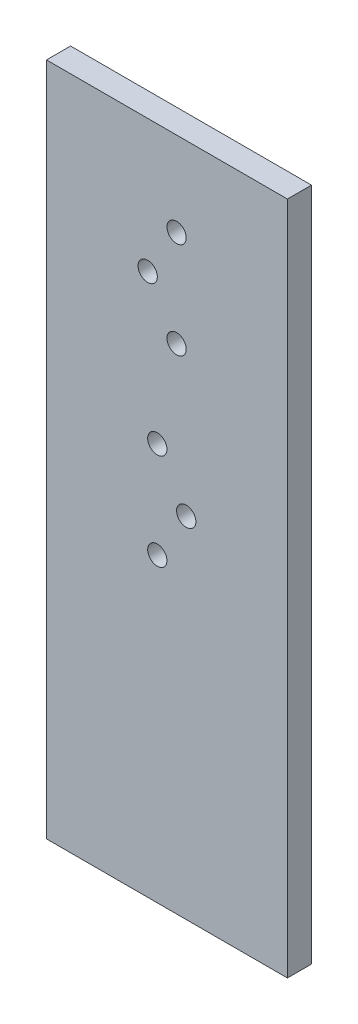
ISO-10303-21;
HEADER;
FILE_DESCRIPTION(('STEP AP214'),'2;1');
FILE_NAME('part.step','',(''),(''),'','','');
FILE_SCHEMA(('AUTOMOTIVE_DESIGN { 1 0 10303 214 1 1 1 1 }'));
ENDSEC;
DATA;
#1=APPLICATION_CONTEXT('core data for automotive mechanical design processes');
#2=APPLICATION_PROTOCOL_DEFINITION('international standard','automotive_design',2000,#1);
#3=PRODUCT_CONTEXT('',#1,'mechanical');
#4=PRODUCT('Part','Part','',(#3));
#5=PRODUCT_RELATED_PRODUCT_CATEGORY('part','',(#4));
#6=PRODUCT_DEFINITION_FORMATION('','',#4);
#7=PRODUCT_DEFINITION_CONTEXT('part definition',#1,'design');
#8=PRODUCT_DEFINITION('design','',#6,#7);
#9=PRODUCT_DEFINITION_SHAPE('','',#8);
#10=(LENGTH_UNIT() NAMED_UNIT(*) SI_UNIT(.MILLI.,.METRE.));
#11=(NAMED_UNIT(*) PLANE_ANGLE_UNIT() SI_UNIT($,.RADIAN.));
#12=(NAMED_UNIT(*) SI_UNIT($,.STERADIAN.) SOLID_ANGLE_UNIT());
#13=UNCERTAINTY_MEASURE_WITH_UNIT(LENGTH_MEASURE(1.E-05),#10,'distance_accuracy_value','');
#14=(GEOMETRIC_REPRESENTATION_CONTEXT(3) GLOBAL_UNCERTAINTY_ASSIGNED_CONTEXT((#13)) GLOBAL_UNIT_ASSIGNED_CONTEXT((#10,
#11,#12)) REPRESENTATION_CONTEXT('',''));
#15=CARTESIAN_POINT('',(0.,0.,0.));
#16=DIRECTION('',(0.,0.,1.));
#17=DIRECTION('',(1.,0.,0.));
#18=AXIS2_PLACEMENT_3D('',#15,#16,#17);
#19=CARTESIAN_POINT('',(-25.,-70.,5.));
#20=DIRECTION('',(1.,0.,0.));
#21=DIRECTION('',(0.,0.,-1.));
#22=AXIS2_PLACEMENT_3D('',#19,#20,#21);
#23=PLANE('',#22);
#24=DIRECTION('',(0.,-1.,0.));
#25=VECTOR('',#24,1.);
#26=CARTESIAN_POINT('',(-25.,-70.,0.));
#27=LINE('',#26,#25);
#28=CARTESIAN_POINT('',(-25.,70.,0.));
#29=VERTEX_POINT('',#28);
#30=CARTESIAN_POINT('',(-25.,-70.,0.));
#31=VERTEX_POINT('',#30);
#32=EDGE_CURVE('E95',#29,#31,#27,.T.);
#33=ORIENTED_EDGE('',*,*,#32,.T.);
#34=DIRECTION('',(0.,0.,-1.));
#35=VECTOR('',#34,1.);
#36=CARTESIAN_POINT('',(-25.,-70.,5.));
#37=LINE('',#36,#35);
#38=CARTESIAN_POINT('',(-25.,-70.,5.));
#39=VERTEX_POINT('',#38);
#40=EDGE_CURVE('E11',#39,#31,#37,.T.);
#41=ORIENTED_EDGE('',*,*,#40,.F.);
#42=DIRECTION('',(0.,-1.,0.));
#43=VECTOR('',#42,1.);
#44=CARTESIAN_POINT('',(-25.,-70.,5.));
#45=LINE('',#44,#43);
#46=CARTESIAN_POINT('',(-25.,70.,5.));
#47=VERTEX_POINT('',#46);
#48=EDGE_CURVE('E83',#47,#39,#45,.T.);
#49=ORIENTED_EDGE('',*,*,#48,.F.);
#50=DIRECTION('',(0.,0.,-1.));
#51=VECTOR('',#50,1.);
#52=CARTESIAN_POINT('',(-25.,70.,5.));
#53=LINE('',#52,#51);
#54=EDGE_CURVE('E91',#47,#29,#53,.T.);
#55=ORIENTED_EDGE('',*,*,#54,.T.);
#56=EDGE_LOOP('',(#33,#41,#49,#55));
#57=FACE_BOUND('',#56,.T.);
#58=ADVANCED_FACE('F32',(#57),#23,.F.);
#59=CARTESIAN_POINT('',(25.,-70.,5.));
#60=DIRECTION('',(0.,1.,0.));
#61=DIRECTION('',(0.,0.,1.));
#62=AXIS2_PLACEMENT_3D('',#59,#60,#61);
#63=PLANE('',#62);
#64=DIRECTION('',(1.,0.,0.));
#65=VECTOR('',#64,1.);
#66=CARTESIAN_POINT('',(25.,-70.,0.));
#67=LINE('',#66,#65);
#68=CARTESIAN_POINT('',(25.,-70.,0.));
#69=VERTEX_POINT('',#68);
#70=EDGE_CURVE('E87',#31,#69,#67,.T.);
#71=ORIENTED_EDGE('',*,*,#70,.T.);
#72=DIRECTION('',(0.,0.,-1.));
#73=VECTOR('',#72,1.);
#74=CARTESIAN_POINT('',(25.,-70.,5.));
#75=LINE('',#74,#73);
#76=CARTESIAN_POINT('',(25.,-70.,5.));
#77=VERTEX_POINT('',#76);
#78=EDGE_CURVE('E40',#77,#69,#75,.T.);
#79=ORIENTED_EDGE('',*,*,#78,.F.);
#80=DIRECTION('',(1.,0.,0.));
#81=VECTOR('',#80,1.);
#82=CARTESIAN_POINT('',(25.,-70.,5.));
#83=LINE('',#82,#81);
#84=EDGE_CURVE('E78',#39,#77,#83,.T.);
#85=ORIENTED_EDGE('',*,*,#84,.F.);
#86=ORIENTED_EDGE('',*,*,#40,.T.);
#87=EDGE_LOOP('',(#71,#79,#85,#86));
#88=FACE_BOUND('',#87,.T.);
#89=ADVANCED_FACE('F86',(#88),#63,.F.);
#90=CARTESIAN_POINT('',(25.,-70.,5.));
#91=DIRECTION('',(-1.,0.,0.));
#92=DIRECTION('',(0.,0.,1.));
#93=AXIS2_PLACEMENT_3D('',#90,#91,#92);
#94=PLANE('',#93);
#95=DIRECTION('',(0.,1.,0.));
#96=VECTOR('',#95,1.);
#97=CARTESIAN_POINT('',(25.,-70.,0.));
#98=LINE('',#97,#96);
#99=CARTESIAN_POINT('',(25.,70.,0.));
#100=VERTEX_POINT('',#99);
#101=EDGE_CURVE('E65',#69,#100,#98,.T.);
#102=ORIENTED_EDGE('',*,*,#101,.T.);
#103=DIRECTION('',(0.,0.,-1.));
#104=VECTOR('',#103,1.);
#105=CARTESIAN_POINT('',(25.,70.,5.));
#106=LINE('',#105,#104);
#107=CARTESIAN_POINT('',(25.,70.,5.));
#108=VERTEX_POINT('',#107);
#109=EDGE_CURVE('E88',#108,#100,#106,.T.);
#110=ORIENTED_EDGE('',*,*,#109,.F.);
#111=DIRECTION('',(0.,1.,0.));
#112=VECTOR('',#111,1.);
#113=CARTESIAN_POINT('',(25.,-70.,5.));
#114=LINE('',#113,#112);
#115=EDGE_CURVE('E81',#77,#108,#114,.T.);
#116=ORIENTED_EDGE('',*,*,#115,.F.);
#117=ORIENTED_EDGE('',*,*,#78,.T.);
#118=EDGE_LOOP('',(#102,#110,#116,#117));
#119=FACE_BOUND('',#118,.T.);
#120=ADVANCED_FACE('F89',(#119),#94,.F.);
#121=CARTESIAN_POINT('',(25.,70.,5.));
#122=DIRECTION('',(0.,-1.,0.));
#123=DIRECTION('',(1.,0.,0.));
#124=AXIS2_PLACEMENT_3D('',#121,#122,#123);
#125=PLANE('',#124);
#126=DIRECTION('',(-1.,0.,0.));
#127=VECTOR('',#126,1.);
#128=CARTESIAN_POINT('',(25.,70.,0.));
#129=LINE('',#128,#127);
#130=EDGE_CURVE('E71',#100,#29,#129,.T.);
#131=ORIENTED_EDGE('',*,*,#130,.T.);
#132=ORIENTED_EDGE('',*,*,#54,.F.);
#133=DIRECTION('',(-1.,0.,0.));
#134=VECTOR('',#133,1.);
#135=CARTESIAN_POINT('',(25.,70.,5.));
#136=LINE('',#135,#134);
#137=EDGE_CURVE('E48',#108,#47,#136,.T.);
#138=ORIENTED_EDGE('',*,*,#137,.F.);
#139=ORIENTED_EDGE('',*,*,#109,.T.);
#140=EDGE_LOOP('',(#131,#132,#138,#139));
#141=FACE_BOUND('',#140,.T.);
#142=ADVANCED_FACE('F103',(#141),#125,.F.);
#143=CARTESIAN_POINT('',(0.,0.,5.));
#144=DIRECTION('',(0.,0.,1.));
#145=DIRECTION('',(1.,0.,0.));
#146=AXIS2_PLACEMENT_3D('',#143,#144,#145);
#147=PLANE('',#146);
#148=CARTESIAN_POINT('',(-4.00000000000001,42.5,5.));
#149=DIRECTION('',(0.,0.,1.));
#150=DIRECTION('',(1.,0.,0.));
#151=AXIS2_PLACEMENT_3D('',#148,#149,#150);
#152=CIRCLE('',#151,2.);
#153=CARTESIAN_POINT('',(-2.,42.5,5.));
#154=VERTEX_POINT('',#153);
#155=EDGE_CURVE('E139',#154,#154,#152,.T.);
#156=ORIENTED_EDGE('',*,*,#155,.F.);
#157=EDGE_LOOP('',(#156));
#158=FACE_BOUND('',#157,.T.);
#159=CARTESIAN_POINT('',(1.99999999999999,32.5,5.));
#160=DIRECTION('',(0.,0.,1.));
#161=DIRECTION('',(1.,0.,0.));
#162=AXIS2_PLACEMENT_3D('',#159,#160,#161);
#163=CIRCLE('',#162,2.);
#164=CARTESIAN_POINT('',(4.,32.5,5.));
#165=VERTEX_POINT('',#164);
#166=EDGE_CURVE('E133',#165,#165,#163,.T.);
#167=ORIENTED_EDGE('',*,*,#166,.F.);
#168=EDGE_LOOP('',(#167));
#169=FACE_BOUND('',#168,.T.);
#170=CARTESIAN_POINT('',(1.99999999999999,52.5,5.));
#171=DIRECTION('',(0.,0.,1.));
#172=DIRECTION('',(1.,0.,0.));
#173=AXIS2_PLACEMENT_3D('',#170,#171,#172);
#174=CIRCLE('',#173,2.);
#175=CARTESIAN_POINT('',(4.,52.5,5.));
#176=VERTEX_POINT('',#175);
#177=EDGE_CURVE('E127',#176,#176,#174,.T.);
#178=ORIENTED_EDGE('',*,*,#177,.F.);
#179=EDGE_LOOP('',(#178));
#180=FACE_BOUND('',#179,.T.);
#181=CARTESIAN_POINT('',(3.99999999999999,2.5,5.));
#182=DIRECTION('',(0.,0.,1.));
#183=DIRECTION('',(1.,0.,0.));
#184=AXIS2_PLACEMENT_3D('',#181,#182,#183);
#185=CIRCLE('',#184,2.);
#186=CARTESIAN_POINT('',(5.99999999999999,2.5,5.));
#187=VERTEX_POINT('',#186);
#188=EDGE_CURVE('E121',#187,#187,#185,.T.);
#189=ORIENTED_EDGE('',*,*,#188,.F.);
#190=EDGE_LOOP('',(#189));
#191=FACE_BOUND('',#190,.T.);
#192=CARTESIAN_POINT('',(-2.00000000000001,-7.50000000000001,5.));
#193=DIRECTION('',(0.,0.,1.));
#194=DIRECTION('',(1.,0.,0.));
#195=AXIS2_PLACEMENT_3D('',#192,#193,#194);
#196=CIRCLE('',#195,2.);
#197=CARTESIAN_POINT('',(0.,-7.50000000000001,5.));
#198=VERTEX_POINT('',#197);
#199=EDGE_CURVE('E115',#198,#198,#196,.T.);
#200=ORIENTED_EDGE('',*,*,#199,.F.);
#201=EDGE_LOOP('',(#200));
#202=FACE_BOUND('',#201,.T.);
#203=CARTESIAN_POINT('',(-2.00000000000001,12.5,5.));
#204=DIRECTION('',(0.,0.,1.));
#205=DIRECTION('',(1.,0.,0.));
#206=AXIS2_PLACEMENT_3D('',#203,#204,#205);
#207=CIRCLE('',#206,2.);
#208=CARTESIAN_POINT('',(0.,12.5,5.));
#209=VERTEX_POINT('',#208);
#210=EDGE_CURVE('E109',#209,#209,#207,.T.);
#211=ORIENTED_EDGE('',*,*,#210,.F.);
#212=EDGE_LOOP('',(#211));
#213=FACE_BOUND('',#212,.T.);
#214=ORIENTED_EDGE('',*,*,#48,.T.);
#215=ORIENTED_EDGE('',*,*,#84,.T.);
#216=ORIENTED_EDGE('',*,*,#115,.T.);
#217=ORIENTED_EDGE('',*,*,#137,.T.);
#218=EDGE_LOOP('',(#214,#215,#216,#217));
#219=FACE_BOUND('',#218,.T.);
#220=ADVANCED_FACE('F79',(#158,#169,#180,#191,#202,#213,#219),#147,.T.);
#221=CARTESIAN_POINT('',(0.,0.,0.));
#222=DIRECTION('',(0.,0.,1.));
#223=DIRECTION('',(1.,0.,0.));
#224=AXIS2_PLACEMENT_3D('',#221,#222,#223);
#225=PLANE('',#224);
#226=CARTESIAN_POINT('',(-4.00000000000001,42.5,0.));
#227=DIRECTION('',(0.,0.,1.));
#228=DIRECTION('',(1.,0.,0.));
#229=AXIS2_PLACEMENT_3D('',#226,#227,#228);
#230=CIRCLE('',#229,2.);
#231=CARTESIAN_POINT('',(-2.,42.5,0.));
#232=VERTEX_POINT('',#231);
#233=EDGE_CURVE('E136',#232,#232,#230,.T.);
#234=ORIENTED_EDGE('',*,*,#233,.T.);
#235=EDGE_LOOP('',(#234));
#236=FACE_BOUND('',#235,.T.);
#237=CARTESIAN_POINT('',(1.99999999999999,32.5,0.));
#238=DIRECTION('',(0.,0.,1.));
#239=DIRECTION('',(1.,0.,0.));
#240=AXIS2_PLACEMENT_3D('',#237,#238,#239);
#241=CIRCLE('',#240,2.);
#242=CARTESIAN_POINT('',(4.,32.5,0.));
#243=VERTEX_POINT('',#242);
#244=EDGE_CURVE('E130',#243,#243,#241,.T.);
#245=ORIENTED_EDGE('',*,*,#244,.T.);
#246=EDGE_LOOP('',(#245));
#247=FACE_BOUND('',#246,.T.);
#248=CARTESIAN_POINT('',(1.99999999999999,52.5,0.));
#249=DIRECTION('',(0.,0.,1.));
#250=DIRECTION('',(1.,0.,0.));
#251=AXIS2_PLACEMENT_3D('',#248,#249,#250);
#252=CIRCLE('',#251,2.);
#253=CARTESIAN_POINT('',(4.,52.5,0.));
#254=VERTEX_POINT('',#253);
#255=EDGE_CURVE('E124',#254,#254,#252,.T.);
#256=ORIENTED_EDGE('',*,*,#255,.T.);
#257=EDGE_LOOP('',(#256));
#258=FACE_BOUND('',#257,.T.);
#259=CARTESIAN_POINT('',(3.99999999999999,2.5,0.));
#260=DIRECTION('',(0.,0.,1.));
#261=DIRECTION('',(1.,0.,0.));
#262=AXIS2_PLACEMENT_3D('',#259,#260,#261);
#263=CIRCLE('',#262,2.);
#264=CARTESIAN_POINT('',(5.99999999999999,2.5,0.));
#265=VERTEX_POINT('',#264);
#266=EDGE_CURVE('E118',#265,#265,#263,.T.);
#267=ORIENTED_EDGE('',*,*,#266,.T.);
#268=EDGE_LOOP('',(#267));
#269=FACE_BOUND('',#268,.T.);
#270=CARTESIAN_POINT('',(-2.00000000000001,-7.50000000000001,0.));
#271=DIRECTION('',(0.,0.,1.));
#272=DIRECTION('',(1.,0.,0.));
#273=AXIS2_PLACEMENT_3D('',#270,#271,#272);
#274=CIRCLE('',#273,2.);
#275=CARTESIAN_POINT('',(0.,-7.50000000000001,0.));
#276=VERTEX_POINT('',#275);
#277=EDGE_CURVE('E112',#276,#276,#274,.T.);
#278=ORIENTED_EDGE('',*,*,#277,.T.);
#279=EDGE_LOOP('',(#278));
#280=FACE_BOUND('',#279,.T.);
#281=CARTESIAN_POINT('',(-2.00000000000001,12.5,0.));
#282=DIRECTION('',(0.,0.,1.));
#283=DIRECTION('',(1.,0.,0.));
#284=AXIS2_PLACEMENT_3D('',#281,#282,#283);
#285=CIRCLE('',#284,2.);
#286=CARTESIAN_POINT('',(0.,12.5,0.));
#287=VERTEX_POINT('',#286);
#288=EDGE_CURVE('E98',#287,#287,#285,.T.);
#289=ORIENTED_EDGE('',*,*,#288,.T.);
#290=EDGE_LOOP('',(#289));
#291=FACE_BOUND('',#290,.T.);
#292=ORIENTED_EDGE('',*,*,#32,.F.);
#293=ORIENTED_EDGE('',*,*,#130,.F.);
#294=ORIENTED_EDGE('',*,*,#101,.F.);
#295=ORIENTED_EDGE('',*,*,#70,.F.);
#296=EDGE_LOOP('',(#292,#293,#294,#295));
#297=FACE_BOUND('',#296,.T.);
#298=ADVANCED_FACE('F106',(#236,#247,#258,#269,#280,#291,#297),#225,.F.);
#299=CARTESIAN_POINT('',(-2.00000000000001,12.5,0.));
#300=DIRECTION('',(0.,0.,1.));
#301=DIRECTION('',(1.,0.,0.));
#302=AXIS2_PLACEMENT_3D('',#299,#300,#301);
#303=CYLINDRICAL_SURFACE('',#302,2.);
#304=ORIENTED_EDGE('',*,*,#288,.F.);
#305=EDGE_LOOP('',(#304));
#306=FACE_BOUND('',#305,.T.);
#307=ORIENTED_EDGE('',*,*,#210,.T.);
#308=EDGE_LOOP('',(#307));
#309=FACE_BOUND('',#308,.T.);
#310=ADVANCED_FACE('F167',(#306,#309),#303,.F.);
#311=CARTESIAN_POINT('',(-2.00000000000001,-7.50000000000001,0.));
#312=DIRECTION('',(0.,0.,1.));
#313=DIRECTION('',(1.,0.,0.));
#314=AXIS2_PLACEMENT_3D('',#311,#312,#313);
#315=CYLINDRICAL_SURFACE('',#314,2.);
#316=ORIENTED_EDGE('',*,*,#277,.F.);
#317=EDGE_LOOP('',(#316));
#318=FACE_BOUND('',#317,.T.);
#319=ORIENTED_EDGE('',*,*,#199,.T.);
#320=EDGE_LOOP('',(#319));
#321=FACE_BOUND('',#320,.T.);
#322=ADVANCED_FACE('F169',(#318,#321),#315,.F.);
#323=CARTESIAN_POINT('',(3.99999999999999,2.5,0.));
#324=DIRECTION('',(0.,0.,1.));
#325=DIRECTION('',(1.,0.,0.));
#326=AXIS2_PLACEMENT_3D('',#323,#324,#325);
#327=CYLINDRICAL_SURFACE('',#326,2.);
#328=ORIENTED_EDGE('',*,*,#266,.F.);
#329=EDGE_LOOP('',(#328));
#330=FACE_BOUND('',#329,.T.);
#331=ORIENTED_EDGE('',*,*,#188,.T.);
#332=EDGE_LOOP('',(#331));
#333=FACE_BOUND('',#332,.T.);
#334=ADVANCED_FACE('F176',(#330,#333),#327,.F.);
#335=CARTESIAN_POINT('',(1.99999999999999,52.5,0.));
#336=DIRECTION('',(0.,0.,1.));
#337=DIRECTION('',(1.,0.,0.));
#338=AXIS2_PLACEMENT_3D('',#335,#336,#337);
#339=CYLINDRICAL_SURFACE('',#338,2.);
#340=ORIENTED_EDGE('',*,*,#255,.F.);
#341=EDGE_LOOP('',(#340));
#342=FACE_BOUND('',#341,.T.);
#343=ORIENTED_EDGE('',*,*,#177,.T.);
#344=EDGE_LOOP('',(#343));
#345=FACE_BOUND('',#344,.T.);
#346=ADVANCED_FACE('F222',(#342,#345),#339,.F.);
#347=CARTESIAN_POINT('',(1.99999999999999,32.5,0.));
#348=DIRECTION('',(0.,0.,1.));
#349=DIRECTION('',(1.,0.,0.));
#350=AXIS2_PLACEMENT_3D('',#347,#348,#349);
#351=CYLINDRICAL_SURFACE('',#350,2.);
#352=ORIENTED_EDGE('',*,*,#244,.F.);
#353=EDGE_LOOP('',(#352));
#354=FACE_BOUND('',#353,.T.);
#355=ORIENTED_EDGE('',*,*,#166,.T.);
#356=EDGE_LOOP('',(#355));
#357=FACE_BOUND('',#356,.T.);
#358=ADVANCED_FACE('F150',(#354,#357),#351,.F.);
#359=CARTESIAN_POINT('',(-4.00000000000001,42.5,0.));
#360=DIRECTION('',(0.,0.,1.));
#361=DIRECTION('',(1.,0.,0.));
#362=AXIS2_PLACEMENT_3D('',#359,#360,#361);
#363=CYLINDRICAL_SURFACE('',#362,2.);
#364=ORIENTED_EDGE('',*,*,#233,.F.);
#365=EDGE_LOOP('',(#364));
#366=FACE_BOUND('',#365,.T.);
#367=ORIENTED_EDGE('',*,*,#155,.T.);
#368=EDGE_LOOP('',(#367));
#369=FACE_BOUND('',#368,.T.);
#370=ADVANCED_FACE('F147',(#366,#369),#363,.F.);
#371=CLOSED_SHELL('',(#58,#89,#120,#142,#220,#298,#310,#322,#334,#346,#358,#370));
#372=MANIFOLD_SOLID_BREP('B2',#371);
#373=ADVANCED_BREP_SHAPE_REPRESENTATION('',(#18,#372),#14);
#374=SHAPE_DEFINITION_REPRESENTATION(#9,#373);
ENDSEC;
END-ISO-10303-21;
